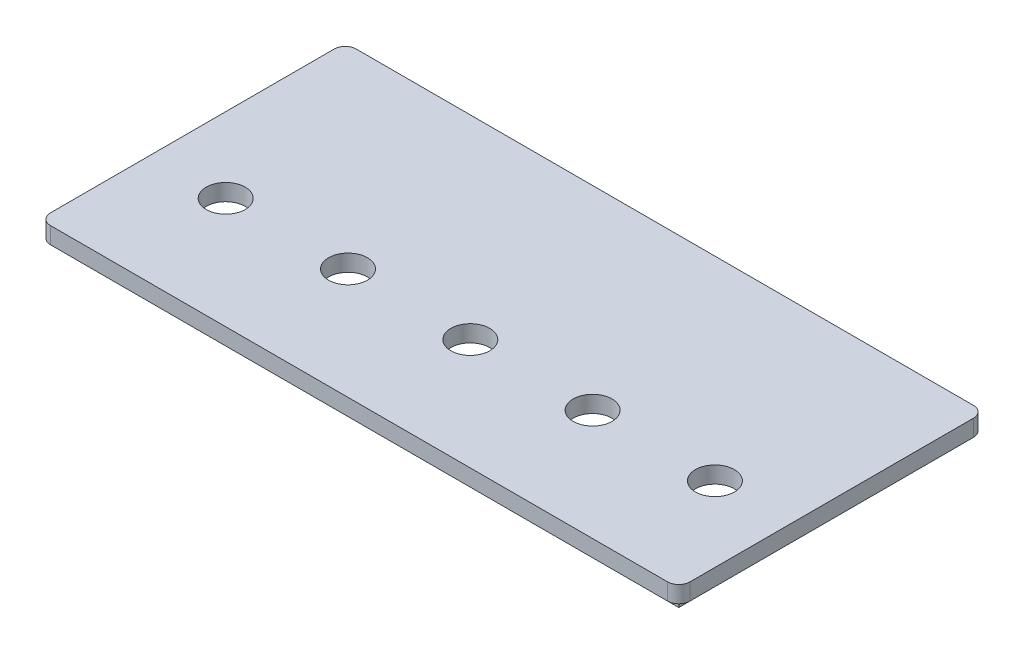
ISO-10303-21;
HEADER;
FILE_DESCRIPTION(('STEP AP214'),'2;1');
FILE_NAME('part.step','',(''),(''),'','','');
FILE_SCHEMA(('AUTOMOTIVE_DESIGN { 1 0 10303 214 1 1 1 1 }'));
ENDSEC;
DATA;
#1=APPLICATION_CONTEXT('core data for automotive mechanical design processes');
#2=APPLICATION_PROTOCOL_DEFINITION('international standard','automotive_design',2000,#1);
#3=PRODUCT_CONTEXT('',#1,'mechanical');
#4=PRODUCT('Part','Part','',(#3));
#5=PRODUCT_RELATED_PRODUCT_CATEGORY('part','',(#4));
#6=PRODUCT_DEFINITION_FORMATION('','',#4);
#7=PRODUCT_DEFINITION_CONTEXT('part definition',#1,'design');
#8=PRODUCT_DEFINITION('design','',#6,#7);
#9=PRODUCT_DEFINITION_SHAPE('','',#8);
#10=(LENGTH_UNIT() NAMED_UNIT(*) SI_UNIT(.MILLI.,.METRE.));
#11=(NAMED_UNIT(*) PLANE_ANGLE_UNIT() SI_UNIT($,.RADIAN.));
#12=(NAMED_UNIT(*) SI_UNIT($,.STERADIAN.) SOLID_ANGLE_UNIT());
#13=UNCERTAINTY_MEASURE_WITH_UNIT(LENGTH_MEASURE(1.E-05),#10,'distance_accuracy_value','');
#14=(GEOMETRIC_REPRESENTATION_CONTEXT(3) GLOBAL_UNCERTAINTY_ASSIGNED_CONTEXT((#13)) GLOBAL_UNIT_ASSIGNED_CONTEXT((#10,
#11,#12)) REPRESENTATION_CONTEXT('',''));
#15=CARTESIAN_POINT('',(0.,0.,0.));
#16=DIRECTION('',(0.,0.,1.));
#17=DIRECTION('',(1.,0.,0.));
#18=AXIS2_PLACEMENT_3D('',#15,#16,#17);
#19=CARTESIAN_POINT('',(0.,0.,0.));
#20=DIRECTION('',(0.,-1.,0.));
#21=DIRECTION('',(0.,0.,-1.));
#22=AXIS2_PLACEMENT_3D('',#19,#20,#21);
#23=PLANE('',#22);
#24=DIRECTION('',(0.,0.,-1.));
#25=VECTOR('',#24,1.);
#26=CARTESIAN_POINT('',(57.5,0.,27.5));
#27=LINE('',#26,#25);
#28=CARTESIAN_POINT('',(57.5,0.,25.5));
#29=VERTEX_POINT('',#28);
#30=CARTESIAN_POINT('',(57.5,0.,-25.5));
#31=VERTEX_POINT('',#30);
#32=EDGE_CURVE('E253',#29,#31,#27,.T.);
#33=ORIENTED_EDGE('',*,*,#32,.F.);
#34=CARTESIAN_POINT('',(55.5,0.,25.5));
#35=DIRECTION('',(0.,-1.,0.));
#36=DIRECTION('',(0.,0.,-1.));
#37=AXIS2_PLACEMENT_3D('',#34,#35,#36);
#38=CIRCLE('',#37,2.);
#39=CARTESIAN_POINT('',(55.5,0.,27.5));
#40=VERTEX_POINT('',#39);
#41=EDGE_CURVE('E333',#29,#40,#38,.T.);
#42=ORIENTED_EDGE('',*,*,#41,.T.);
#43=DIRECTION('',(1.,0.,0.));
#44=VECTOR('',#43,1.);
#45=CARTESIAN_POINT('',(-57.5,0.,27.5));
#46=LINE('',#45,#44);
#47=CARTESIAN_POINT('',(-55.5,0.,27.5));
#48=VERTEX_POINT('',#47);
#49=EDGE_CURVE('E294',#48,#40,#46,.T.);
#50=ORIENTED_EDGE('',*,*,#49,.F.);
#51=CARTESIAN_POINT('',(-55.5,0.,25.5));
#52=DIRECTION('',(0.,-1.,0.));
#53=DIRECTION('',(0.,0.,-1.));
#54=AXIS2_PLACEMENT_3D('',#51,#52,#53);
#55=CIRCLE('',#54,2.);
#56=CARTESIAN_POINT('',(-57.5,0.,25.5));
#57=VERTEX_POINT('',#56);
#58=EDGE_CURVE('E327',#48,#57,#55,.T.);
#59=ORIENTED_EDGE('',*,*,#58,.T.);
#60=DIRECTION('',(0.,0.,1.));
#61=VECTOR('',#60,1.);
#62=CARTESIAN_POINT('',(-57.5,0.,27.5));
#63=LINE('',#62,#61);
#64=CARTESIAN_POINT('',(-57.5,0.,-25.5));
#65=VERTEX_POINT('',#64);
#66=EDGE_CURVE('E312',#65,#57,#63,.T.);
#67=ORIENTED_EDGE('',*,*,#66,.F.);
#68=CARTESIAN_POINT('',(-55.5,0.,-25.5));
#69=DIRECTION('',(0.,-1.,0.));
#70=DIRECTION('',(0.,0.,-1.));
#71=AXIS2_PLACEMENT_3D('',#68,#69,#70);
#72=CIRCLE('',#71,2.);
#73=CARTESIAN_POINT('',(-55.5,0.,-27.5));
#74=VERTEX_POINT('',#73);
#75=EDGE_CURVE('E324',#65,#74,#72,.T.);
#76=ORIENTED_EDGE('',*,*,#75,.T.);
#77=DIRECTION('',(-1.,0.,0.));
#78=VECTOR('',#77,1.);
#79=CARTESIAN_POINT('',(-57.5,0.,-27.5));
#80=LINE('',#79,#78);
#81=CARTESIAN_POINT('',(55.5,0.,-27.5));
#82=VERTEX_POINT('',#81);
#83=EDGE_CURVE('E308',#82,#74,#80,.T.);
#84=ORIENTED_EDGE('',*,*,#83,.F.);
#85=CARTESIAN_POINT('',(55.5,0.,-25.5));
#86=DIRECTION('',(0.,-1.,0.));
#87=DIRECTION('',(0.,0.,-1.));
#88=AXIS2_PLACEMENT_3D('',#85,#86,#87);
#89=CIRCLE('',#88,2.);
#90=EDGE_CURVE('E330',#82,#31,#89,.T.);
#91=ORIENTED_EDGE('',*,*,#90,.T.);
#92=EDGE_LOOP('',(#33,#42,#50,#59,#67,#76,#84,#91));
#93=FACE_BOUND('',#92,.T.);
#94=DIRECTION('',(-1.,0.,0.));
#95=VECTOR('',#94,1.);
#96=CARTESIAN_POINT('',(-55.5,0.,25.5));
#97=LINE('',#96,#95);
#98=CARTESIAN_POINT('',(55.5,0.,25.5));
#99=VERTEX_POINT('',#98);
#100=CARTESIAN_POINT('',(-55.5,0.,25.5));
#101=VERTEX_POINT('',#100);
#102=EDGE_CURVE('E226',#99,#101,#97,.T.);
#103=ORIENTED_EDGE('',*,*,#102,.F.);
#104=DIRECTION('',(0.,0.,1.));
#105=VECTOR('',#104,1.);
#106=CARTESIAN_POINT('',(55.5,0.,25.5));
#107=LINE('',#106,#105);
#108=CARTESIAN_POINT('',(55.5,0.,-25.5));
#109=VERTEX_POINT('',#108);
#110=EDGE_CURVE('E175',#109,#99,#107,.T.);
#111=ORIENTED_EDGE('',*,*,#110,.F.);
#112=DIRECTION('',(1.,0.,0.));
#113=VECTOR('',#112,1.);
#114=CARTESIAN_POINT('',(-55.5,0.,-25.5));
#115=LINE('',#114,#113);
#116=CARTESIAN_POINT('',(-55.5,0.,-25.5));
#117=VERTEX_POINT('',#116);
#118=EDGE_CURVE('E213',#117,#109,#115,.T.);
#119=ORIENTED_EDGE('',*,*,#118,.F.);
#120=DIRECTION('',(0.,0.,-1.));
#121=VECTOR('',#120,1.);
#122=CARTESIAN_POINT('',(-55.5,0.,25.5));
#123=LINE('',#122,#121);
#124=EDGE_CURVE('E229',#101,#117,#123,.T.);
#125=ORIENTED_EDGE('',*,*,#124,.F.);
#126=EDGE_LOOP('',(#103,#111,#119,#125));
#127=FACE_BOUND('',#126,.T.);
#128=ADVANCED_FACE('F39',(#93,#127),#23,.T.);
#129=CARTESIAN_POINT('',(57.5,3.,27.5));
#130=DIRECTION('',(-1.,0.,0.));
#131=DIRECTION('',(0.,0.,1.));
#132=AXIS2_PLACEMENT_3D('',#129,#130,#131);
#133=PLANE('',#132);
#134=DIRECTION('',(0.,0.,-1.));
#135=VECTOR('',#134,1.);
#136=CARTESIAN_POINT('',(57.5,3.,27.5));
#137=LINE('',#136,#135);
#138=CARTESIAN_POINT('',(57.5,3.,25.5));
#139=VERTEX_POINT('',#138);
#140=CARTESIAN_POINT('',(57.5,3.,-25.5));
#141=VERTEX_POINT('',#140);
#142=EDGE_CURVE('E289',#139,#141,#137,.T.);
#143=ORIENTED_EDGE('',*,*,#142,.F.);
#144=DIRECTION('',(0.,-1.,0.));
#145=VECTOR('',#144,1.);
#146=CARTESIAN_POINT('',(57.5,3.,25.5));
#147=LINE('',#146,#145);
#148=EDGE_CURVE('E320',#139,#29,#147,.T.);
#149=ORIENTED_EDGE('',*,*,#148,.T.);
#150=ORIENTED_EDGE('',*,*,#32,.T.);
#151=DIRECTION('',(0.,-1.,0.));
#152=VECTOR('',#151,1.);
#153=CARTESIAN_POINT('',(57.5,3.,-25.5));
#154=LINE('',#153,#152);
#155=EDGE_CURVE('E304',#31,#141,#154,.F.);
#156=ORIENTED_EDGE('',*,*,#155,.T.);
#157=EDGE_LOOP('',(#143,#149,#150,#156));
#158=FACE_BOUND('',#157,.T.);
#159=ADVANCED_FACE('F386',(#158),#133,.F.);
#160=CARTESIAN_POINT('',(-57.5,3.,-27.5));
#161=DIRECTION('',(0.,0.,1.));
#162=DIRECTION('',(1.,0.,0.));
#163=AXIS2_PLACEMENT_3D('',#160,#161,#162);
#164=PLANE('',#163);
#165=DIRECTION('',(-1.,0.,0.));
#166=VECTOR('',#165,1.);
#167=CARTESIAN_POINT('',(-57.5,3.,-27.5));
#168=LINE('',#167,#166);
#169=CARTESIAN_POINT('',(55.5,3.,-27.5));
#170=VERTEX_POINT('',#169);
#171=CARTESIAN_POINT('',(-55.5,3.,-27.5));
#172=VERTEX_POINT('',#171);
#173=EDGE_CURVE('E293',#170,#172,#168,.T.);
#174=ORIENTED_EDGE('',*,*,#173,.F.);
#175=DIRECTION('',(0.,-1.,0.));
#176=VECTOR('',#175,1.);
#177=CARTESIAN_POINT('',(55.5,3.,-27.5));
#178=LINE('',#177,#176);
#179=EDGE_CURVE('E357',#170,#82,#178,.T.);
#180=ORIENTED_EDGE('',*,*,#179,.T.);
#181=ORIENTED_EDGE('',*,*,#83,.T.);
#182=DIRECTION('',(0.,-1.,0.));
#183=VECTOR('',#182,1.);
#184=CARTESIAN_POINT('',(-55.5,3.,-27.5));
#185=LINE('',#184,#183);
#186=EDGE_CURVE('E354',#74,#172,#185,.F.);
#187=ORIENTED_EDGE('',*,*,#186,.T.);
#188=EDGE_LOOP('',(#174,#180,#181,#187));
#189=FACE_BOUND('',#188,.T.);
#190=ADVANCED_FACE('F394',(#189),#164,.F.);
#191=CARTESIAN_POINT('',(-57.5,3.,27.5));
#192=DIRECTION('',(1.,0.,0.));
#193=DIRECTION('',(0.,0.,-1.));
#194=AXIS2_PLACEMENT_3D('',#191,#192,#193);
#195=PLANE('',#194);
#196=ORIENTED_EDGE('',*,*,#66,.T.);
#197=DIRECTION('',(0.,-1.,0.));
#198=VECTOR('',#197,1.);
#199=CARTESIAN_POINT('',(-57.5,3.,25.5));
#200=LINE('',#199,#198);
#201=CARTESIAN_POINT('',(-57.5,3.,25.5));
#202=VERTEX_POINT('',#201);
#203=EDGE_CURVE('E11',#57,#202,#200,.F.);
#204=ORIENTED_EDGE('',*,*,#203,.T.);
#205=DIRECTION('',(0.,0.,1.));
#206=VECTOR('',#205,1.);
#207=CARTESIAN_POINT('',(-57.5,3.,27.5));
#208=LINE('',#207,#206);
#209=CARTESIAN_POINT('',(-57.5,3.,-25.5));
#210=VERTEX_POINT('',#209);
#211=EDGE_CURVE('E297',#210,#202,#208,.T.);
#212=ORIENTED_EDGE('',*,*,#211,.F.);
#213=DIRECTION('',(0.,-1.,0.));
#214=VECTOR('',#213,1.);
#215=CARTESIAN_POINT('',(-57.5,3.,-25.5));
#216=LINE('',#215,#214);
#217=EDGE_CURVE('E48',#210,#65,#216,.T.);
#218=ORIENTED_EDGE('',*,*,#217,.T.);
#219=EDGE_LOOP('',(#196,#204,#212,#218));
#220=FACE_BOUND('',#219,.T.);
#221=ADVANCED_FACE('F364',(#220),#195,.F.);
#222=CARTESIAN_POINT('',(-57.5,3.,27.5));
#223=DIRECTION('',(0.,0.,-1.));
#224=DIRECTION('',(-1.,0.,0.));
#225=AXIS2_PLACEMENT_3D('',#222,#223,#224);
#226=PLANE('',#225);
#227=ORIENTED_EDGE('',*,*,#49,.T.);
#228=DIRECTION('',(0.,-1.,0.));
#229=VECTOR('',#228,1.);
#230=CARTESIAN_POINT('',(55.5,3.,27.5));
#231=LINE('',#230,#229);
#232=CARTESIAN_POINT('',(55.5,3.,27.5));
#233=VERTEX_POINT('',#232);
#234=EDGE_CURVE('E340',#40,#233,#231,.F.);
#235=ORIENTED_EDGE('',*,*,#234,.T.);
#236=DIRECTION('',(1.,0.,0.));
#237=VECTOR('',#236,1.);
#238=CARTESIAN_POINT('',(-57.5,3.,27.5));
#239=LINE('',#238,#237);
#240=CARTESIAN_POINT('',(-55.5,3.,27.5));
#241=VERTEX_POINT('',#240);
#242=EDGE_CURVE('E300',#241,#233,#239,.T.);
#243=ORIENTED_EDGE('',*,*,#242,.F.);
#244=DIRECTION('',(0.,-1.,0.));
#245=VECTOR('',#244,1.);
#246=CARTESIAN_POINT('',(-55.5,3.,27.5));
#247=LINE('',#246,#245);
#248=EDGE_CURVE('E336',#241,#48,#247,.T.);
#249=ORIENTED_EDGE('',*,*,#248,.T.);
#250=EDGE_LOOP('',(#227,#235,#243,#249));
#251=FACE_BOUND('',#250,.T.);
#252=ADVANCED_FACE('F377',(#251),#226,.F.);
#253=CARTESIAN_POINT('',(0.,3.,0.));
#254=DIRECTION('',(0.,-1.,0.));
#255=DIRECTION('',(0.,0.,-1.));
#256=AXIS2_PLACEMENT_3D('',#253,#254,#255);
#257=PLANE('',#256);
#258=CARTESIAN_POINT('',(-44.,3.,7.50000000000001));
#259=DIRECTION('',(0.,1.,0.));
#260=DIRECTION('',(0.,0.,1.));
#261=AXIS2_PLACEMENT_3D('',#258,#259,#260);
#262=CIRCLE('',#261,3.5);
#263=CARTESIAN_POINT('',(-44.,3.,11.));
#264=VERTEX_POINT('',#263);
#265=EDGE_CURVE('E254',#264,#264,#262,.T.);
#266=ORIENTED_EDGE('',*,*,#265,.F.);
#267=EDGE_LOOP('',(#266));
#268=FACE_BOUND('',#267,.T.);
#269=CARTESIAN_POINT('',(-22.,3.,7.50000000000001));
#270=DIRECTION('',(0.,1.,0.));
#271=DIRECTION('',(0.,0.,1.));
#272=AXIS2_PLACEMENT_3D('',#269,#270,#271);
#273=CIRCLE('',#272,3.5);
#274=CARTESIAN_POINT('',(-22.,3.,11.));
#275=VERTEX_POINT('',#274);
#276=EDGE_CURVE('E262',#275,#275,#273,.T.);
#277=ORIENTED_EDGE('',*,*,#276,.F.);
#278=EDGE_LOOP('',(#277));
#279=FACE_BOUND('',#278,.T.);
#280=CARTESIAN_POINT('',(0.,3.,7.50000000000001));
#281=DIRECTION('',(0.,1.,0.));
#282=DIRECTION('',(0.,0.,1.));
#283=AXIS2_PLACEMENT_3D('',#280,#281,#282);
#284=CIRCLE('',#283,3.5);
#285=CARTESIAN_POINT('',(0.,3.,11.));
#286=VERTEX_POINT('',#285);
#287=EDGE_CURVE('E270',#286,#286,#284,.T.);
#288=ORIENTED_EDGE('',*,*,#287,.F.);
#289=EDGE_LOOP('',(#288));
#290=FACE_BOUND('',#289,.T.);
#291=CARTESIAN_POINT('',(22.,3.,7.50000000000001));
#292=DIRECTION('',(0.,1.,0.));
#293=DIRECTION('',(0.,0.,1.));
#294=AXIS2_PLACEMENT_3D('',#291,#292,#293);
#295=CIRCLE('',#294,3.5);
#296=CARTESIAN_POINT('',(22.,3.,11.));
#297=VERTEX_POINT('',#296);
#298=EDGE_CURVE('E278',#297,#297,#295,.T.);
#299=ORIENTED_EDGE('',*,*,#298,.F.);
#300=EDGE_LOOP('',(#299));
#301=FACE_BOUND('',#300,.T.);
#302=CARTESIAN_POINT('',(44.,3.,7.50000000000001));
#303=DIRECTION('',(0.,1.,0.));
#304=DIRECTION('',(0.,0.,1.));
#305=AXIS2_PLACEMENT_3D('',#302,#303,#304);
#306=CIRCLE('',#305,3.5);
#307=CARTESIAN_POINT('',(44.,3.,11.));
#308=VERTEX_POINT('',#307);
#309=EDGE_CURVE('E248',#308,#308,#306,.T.);
#310=ORIENTED_EDGE('',*,*,#309,.F.);
#311=EDGE_LOOP('',(#310));
#312=FACE_BOUND('',#311,.T.);
#313=ORIENTED_EDGE('',*,*,#242,.T.);
#314=CARTESIAN_POINT('',(55.5,3.,25.5));
#315=DIRECTION('',(0.,-1.,0.));
#316=DIRECTION('',(0.,0.,-1.));
#317=AXIS2_PLACEMENT_3D('',#314,#315,#316);
#318=CIRCLE('',#317,2.);
#319=EDGE_CURVE('E351',#233,#139,#318,.F.);
#320=ORIENTED_EDGE('',*,*,#319,.T.);
#321=ORIENTED_EDGE('',*,*,#142,.T.);
#322=CARTESIAN_POINT('',(55.5,3.,-25.5));
#323=DIRECTION('',(0.,-1.,0.));
#324=DIRECTION('',(0.,0.,-1.));
#325=AXIS2_PLACEMENT_3D('',#322,#323,#324);
#326=CIRCLE('',#325,2.);
#327=EDGE_CURVE('E348',#141,#170,#326,.F.);
#328=ORIENTED_EDGE('',*,*,#327,.T.);
#329=ORIENTED_EDGE('',*,*,#173,.T.);
#330=CARTESIAN_POINT('',(-55.5,3.,-25.5));
#331=DIRECTION('',(0.,-1.,0.));
#332=DIRECTION('',(0.,0.,-1.));
#333=AXIS2_PLACEMENT_3D('',#330,#331,#332);
#334=CIRCLE('',#333,2.);
#335=EDGE_CURVE('E60',#172,#210,#334,.F.);
#336=ORIENTED_EDGE('',*,*,#335,.T.);
#337=ORIENTED_EDGE('',*,*,#211,.T.);
#338=CARTESIAN_POINT('',(-55.5,3.,25.5));
#339=DIRECTION('',(0.,-1.,0.));
#340=DIRECTION('',(0.,0.,-1.));
#341=AXIS2_PLACEMENT_3D('',#338,#339,#340);
#342=CIRCLE('',#341,2.);
#343=EDGE_CURVE('E345',#202,#241,#342,.F.);
#344=ORIENTED_EDGE('',*,*,#343,.T.);
#345=EDGE_LOOP('',(#313,#320,#321,#328,#329,#336,#337,#344));
#346=FACE_BOUND('',#345,.T.);
#347=ADVANCED_FACE('F380',(#268,#279,#290,#301,#312,#346),#257,.F.);
#348=DIRECTION('',(0.,0.,-1.));
#349=VECTOR('',#348,1.);
#350=CARTESIAN_POINT('',(-53.5,0.,23.5));
#351=LINE('',#350,#349);
#352=CARTESIAN_POINT('',(-53.5,0.,23.5));
#353=VERTEX_POINT('',#352);
#354=CARTESIAN_POINT('',(-53.5,0.,-23.5));
#355=VERTEX_POINT('',#354);
#356=EDGE_CURVE('E190',#353,#355,#351,.T.);
#357=ORIENTED_EDGE('',*,*,#356,.T.);
#358=DIRECTION('',(1.,0.,0.));
#359=VECTOR('',#358,1.);
#360=CARTESIAN_POINT('',(53.5,0.,-23.5));
#361=LINE('',#360,#359);
#362=CARTESIAN_POINT('',(53.5,0.,-23.5));
#363=VERTEX_POINT('',#362);
#364=EDGE_CURVE('E173',#355,#363,#361,.T.);
#365=ORIENTED_EDGE('',*,*,#364,.T.);
#366=DIRECTION('',(0.,0.,1.));
#367=VECTOR('',#366,1.);
#368=CARTESIAN_POINT('',(53.5,0.,23.5));
#369=LINE('',#368,#367);
#370=CARTESIAN_POINT('',(53.5,0.,23.5));
#371=VERTEX_POINT('',#370);
#372=EDGE_CURVE('E195',#363,#371,#369,.T.);
#373=ORIENTED_EDGE('',*,*,#372,.T.);
#374=DIRECTION('',(-1.,0.,0.));
#375=VECTOR('',#374,1.);
#376=CARTESIAN_POINT('',(53.5,0.,23.5));
#377=LINE('',#376,#375);
#378=EDGE_CURVE('E166',#371,#353,#377,.T.);
#379=ORIENTED_EDGE('',*,*,#378,.T.);
#380=EDGE_LOOP('',(#357,#365,#373,#379));
#381=FACE_BOUND('',#380,.T.);
#382=CARTESIAN_POINT('',(-44.,0.,7.50000000000001));
#383=DIRECTION('',(0.,1.,0.));
#384=DIRECTION('',(0.,0.,1.));
#385=AXIS2_PLACEMENT_3D('',#382,#383,#384);
#386=CIRCLE('',#385,3.5);
#387=CARTESIAN_POINT('',(-44.,0.,11.));
#388=VERTEX_POINT('',#387);
#389=EDGE_CURVE('E249',#388,#388,#386,.T.);
#390=ORIENTED_EDGE('',*,*,#389,.T.);
#391=EDGE_LOOP('',(#390));
#392=FACE_BOUND('',#391,.T.);
#393=CARTESIAN_POINT('',(-22.,0.,7.50000000000001));
#394=DIRECTION('',(0.,1.,0.));
#395=DIRECTION('',(0.,0.,1.));
#396=AXIS2_PLACEMENT_3D('',#393,#394,#395);
#397=CIRCLE('',#396,3.5);
#398=CARTESIAN_POINT('',(-22.,0.,11.));
#399=VERTEX_POINT('',#398);
#400=EDGE_CURVE('E258',#399,#399,#397,.T.);
#401=ORIENTED_EDGE('',*,*,#400,.T.);
#402=EDGE_LOOP('',(#401));
#403=FACE_BOUND('',#402,.T.);
#404=CARTESIAN_POINT('',(0.,0.,7.50000000000001));
#405=DIRECTION('',(0.,1.,0.));
#406=DIRECTION('',(0.,0.,1.));
#407=AXIS2_PLACEMENT_3D('',#404,#405,#406);
#408=CIRCLE('',#407,3.5);
#409=CARTESIAN_POINT('',(0.,0.,11.));
#410=VERTEX_POINT('',#409);
#411=EDGE_CURVE('E266',#410,#410,#408,.T.);
#412=ORIENTED_EDGE('',*,*,#411,.T.);
#413=EDGE_LOOP('',(#412));
#414=FACE_BOUND('',#413,.T.);
#415=CARTESIAN_POINT('',(22.,0.,7.50000000000001));
#416=DIRECTION('',(0.,1.,0.));
#417=DIRECTION('',(0.,0.,1.));
#418=AXIS2_PLACEMENT_3D('',#415,#416,#417);
#419=CIRCLE('',#418,3.5);
#420=CARTESIAN_POINT('',(22.,0.,11.));
#421=VERTEX_POINT('',#420);
#422=EDGE_CURVE('E274',#421,#421,#419,.T.);
#423=ORIENTED_EDGE('',*,*,#422,.T.);
#424=EDGE_LOOP('',(#423));
#425=FACE_BOUND('',#424,.T.);
#426=CARTESIAN_POINT('',(44.,0.,7.50000000000001));
#427=DIRECTION('',(0.,1.,0.));
#428=DIRECTION('',(0.,0.,1.));
#429=AXIS2_PLACEMENT_3D('',#426,#427,#428);
#430=CIRCLE('',#429,3.5);
#431=CARTESIAN_POINT('',(44.,0.,11.));
#432=VERTEX_POINT('',#431);
#433=EDGE_CURVE('E282',#432,#432,#430,.T.);
#434=ORIENTED_EDGE('',*,*,#433,.T.);
#435=EDGE_LOOP('',(#434));
#436=FACE_BOUND('',#435,.T.);
#437=ADVANCED_FACE('F402',(#381,#392,#403,#414,#425,#436),#23,.T.);
#438=CARTESIAN_POINT('',(44.,0.,7.50000000000001));
#439=DIRECTION('',(0.,1.,0.));
#440=DIRECTION('',(0.,0.,1.));
#441=AXIS2_PLACEMENT_3D('',#438,#439,#440);
#442=CYLINDRICAL_SURFACE('',#441,3.5);
#443=ORIENTED_EDGE('',*,*,#433,.F.);
#444=EDGE_LOOP('',(#443));
#445=FACE_BOUND('',#444,.T.);
#446=ORIENTED_EDGE('',*,*,#309,.T.);
#447=EDGE_LOOP('',(#446));
#448=FACE_BOUND('',#447,.T.);
#449=ADVANCED_FACE('F410',(#445,#448),#442,.F.);
#450=CARTESIAN_POINT('',(22.,0.,7.50000000000001));
#451=DIRECTION('',(0.,1.,0.));
#452=DIRECTION('',(0.,0.,1.));
#453=AXIS2_PLACEMENT_3D('',#450,#451,#452);
#454=CYLINDRICAL_SURFACE('',#453,3.5);
#455=ORIENTED_EDGE('',*,*,#422,.F.);
#456=EDGE_LOOP('',(#455));
#457=FACE_BOUND('',#456,.T.);
#458=ORIENTED_EDGE('',*,*,#298,.T.);
#459=EDGE_LOOP('',(#458));
#460=FACE_BOUND('',#459,.T.);
#461=ADVANCED_FACE('F416',(#457,#460),#454,.F.);
#462=CARTESIAN_POINT('',(0.,0.,7.50000000000001));
#463=DIRECTION('',(0.,1.,0.));
#464=DIRECTION('',(0.,0.,1.));
#465=AXIS2_PLACEMENT_3D('',#462,#463,#464);
#466=CYLINDRICAL_SURFACE('',#465,3.5);
#467=ORIENTED_EDGE('',*,*,#411,.F.);
#468=EDGE_LOOP('',(#467));
#469=FACE_BOUND('',#468,.T.);
#470=ORIENTED_EDGE('',*,*,#287,.T.);
#471=EDGE_LOOP('',(#470));
#472=FACE_BOUND('',#471,.T.);
#473=ADVANCED_FACE('F436',(#469,#472),#466,.F.);
#474=CARTESIAN_POINT('',(-22.,0.,7.50000000000001));
#475=DIRECTION('',(0.,1.,0.));
#476=DIRECTION('',(0.,0.,1.));
#477=AXIS2_PLACEMENT_3D('',#474,#475,#476);
#478=CYLINDRICAL_SURFACE('',#477,3.5);
#479=ORIENTED_EDGE('',*,*,#400,.F.);
#480=EDGE_LOOP('',(#479));
#481=FACE_BOUND('',#480,.T.);
#482=ORIENTED_EDGE('',*,*,#276,.T.);
#483=EDGE_LOOP('',(#482));
#484=FACE_BOUND('',#483,.T.);
#485=ADVANCED_FACE('F443',(#481,#484),#478,.F.);
#486=CARTESIAN_POINT('',(-44.,0.,7.50000000000001));
#487=DIRECTION('',(0.,1.,0.));
#488=DIRECTION('',(0.,0.,1.));
#489=AXIS2_PLACEMENT_3D('',#486,#487,#488);
#490=CYLINDRICAL_SURFACE('',#489,3.5);
#491=ORIENTED_EDGE('',*,*,#389,.F.);
#492=EDGE_LOOP('',(#491));
#493=FACE_BOUND('',#492,.T.);
#494=ORIENTED_EDGE('',*,*,#265,.T.);
#495=EDGE_LOOP('',(#494));
#496=FACE_BOUND('',#495,.T.);
#497=ADVANCED_FACE('F449',(#493,#496),#490,.F.);
#498=CARTESIAN_POINT('',(0.,-2.,0.));
#499=DIRECTION('',(0.,-1.,0.));
#500=DIRECTION('',(0.,0.,-1.));
#501=AXIS2_PLACEMENT_3D('',#498,#499,#500);
#502=PLANE('',#501);
#503=DIRECTION('',(0.,0.,1.));
#504=VECTOR('',#503,1.);
#505=CARTESIAN_POINT('',(55.5,-2.,25.5));
#506=LINE('',#505,#504);
#507=CARTESIAN_POINT('',(55.5,-2.,-25.5));
#508=VERTEX_POINT('',#507);
#509=CARTESIAN_POINT('',(55.5,-2.,25.5));
#510=VERTEX_POINT('',#509);
#511=EDGE_CURVE('E208',#508,#510,#506,.T.);
#512=ORIENTED_EDGE('',*,*,#511,.T.);
#513=DIRECTION('',(-1.,0.,0.));
#514=VECTOR('',#513,1.);
#515=CARTESIAN_POINT('',(-55.5,-2.,25.5));
#516=LINE('',#515,#514);
#517=CARTESIAN_POINT('',(-55.5,-2.,25.5));
#518=VERTEX_POINT('',#517);
#519=EDGE_CURVE('E212',#510,#518,#516,.T.);
#520=ORIENTED_EDGE('',*,*,#519,.T.);
#521=DIRECTION('',(0.,0.,-1.));
#522=VECTOR('',#521,1.);
#523=CARTESIAN_POINT('',(-55.5,-2.,25.5));
#524=LINE('',#523,#522);
#525=CARTESIAN_POINT('',(-55.5,-2.,-25.5));
#526=VERTEX_POINT('',#525);
#527=EDGE_CURVE('E216',#518,#526,#524,.T.);
#528=ORIENTED_EDGE('',*,*,#527,.T.);
#529=DIRECTION('',(1.,0.,0.));
#530=VECTOR('',#529,1.);
#531=CARTESIAN_POINT('',(-55.5,-2.,-25.5));
#532=LINE('',#531,#530);
#533=EDGE_CURVE('E219',#526,#508,#532,.T.);
#534=ORIENTED_EDGE('',*,*,#533,.T.);
#535=EDGE_LOOP('',(#512,#520,#528,#534));
#536=FACE_BOUND('',#535,.T.);
#537=DIRECTION('',(1.,0.,0.));
#538=VECTOR('',#537,1.);
#539=CARTESIAN_POINT('',(53.5,-2.,-23.5));
#540=LINE('',#539,#538);
#541=CARTESIAN_POINT('',(-53.5,-2.,-23.5));
#542=VERTEX_POINT('',#541);
#543=CARTESIAN_POINT('',(53.5,-2.,-23.5));
#544=VERTEX_POINT('',#543);
#545=EDGE_CURVE('E165',#542,#544,#540,.T.);
#546=ORIENTED_EDGE('',*,*,#545,.F.);
#547=DIRECTION('',(0.,0.,-1.));
#548=VECTOR('',#547,1.);
#549=CARTESIAN_POINT('',(-53.5,-2.,23.5));
#550=LINE('',#549,#548);
#551=CARTESIAN_POINT('',(-53.5,-2.,23.5));
#552=VERTEX_POINT('',#551);
#553=EDGE_CURVE('E154',#552,#542,#550,.T.);
#554=ORIENTED_EDGE('',*,*,#553,.F.);
#555=DIRECTION('',(-1.,0.,0.));
#556=VECTOR('',#555,1.);
#557=CARTESIAN_POINT('',(53.5,-2.,23.5));
#558=LINE('',#557,#556);
#559=CARTESIAN_POINT('',(53.5,-2.,23.5));
#560=VERTEX_POINT('',#559);
#561=EDGE_CURVE('E185',#560,#552,#558,.T.);
#562=ORIENTED_EDGE('',*,*,#561,.F.);
#563=DIRECTION('',(0.,0.,1.));
#564=VECTOR('',#563,1.);
#565=CARTESIAN_POINT('',(53.5,-2.,23.5));
#566=LINE('',#565,#564);
#567=EDGE_CURVE('E181',#544,#560,#566,.T.);
#568=ORIENTED_EDGE('',*,*,#567,.F.);
#569=EDGE_LOOP('',(#546,#554,#562,#568));
#570=FACE_BOUND('',#569,.T.);
#571=ADVANCED_FACE('F179',(#536,#570),#502,.T.);
#572=CARTESIAN_POINT('',(55.5,-2.,25.5));
#573=DIRECTION('',(-1.,0.,0.));
#574=DIRECTION('',(0.,0.,1.));
#575=AXIS2_PLACEMENT_3D('',#572,#573,#574);
#576=PLANE('',#575);
#577=ORIENTED_EDGE('',*,*,#110,.T.);
#578=DIRECTION('',(0.,1.,0.));
#579=VECTOR('',#578,1.);
#580=CARTESIAN_POINT('',(55.5,-2.,25.5));
#581=LINE('',#580,#579);
#582=EDGE_CURVE('E245',#510,#99,#581,.T.);
#583=ORIENTED_EDGE('',*,*,#582,.F.);
#584=ORIENTED_EDGE('',*,*,#511,.F.);
#585=DIRECTION('',(0.,1.,0.));
#586=VECTOR('',#585,1.);
#587=CARTESIAN_POINT('',(55.5,-2.,-25.5));
#588=LINE('',#587,#586);
#589=EDGE_CURVE('E222',#508,#109,#588,.T.);
#590=ORIENTED_EDGE('',*,*,#589,.T.);
#591=EDGE_LOOP('',(#577,#583,#584,#590));
#592=FACE_BOUND('',#591,.T.);
#593=ADVANCED_FACE('F454',(#592),#576,.F.);
#594=CARTESIAN_POINT('',(-55.5,-2.,25.5));
#595=DIRECTION('',(0.,0.,-1.));
#596=DIRECTION('',(-1.,0.,0.));
#597=AXIS2_PLACEMENT_3D('',#594,#595,#596);
#598=PLANE('',#597);
#599=ORIENTED_EDGE('',*,*,#102,.T.);
#600=DIRECTION('',(0.,1.,0.));
#601=VECTOR('',#600,1.);
#602=CARTESIAN_POINT('',(-55.5,-2.,25.5));
#603=LINE('',#602,#601);
#604=EDGE_CURVE('E241',#518,#101,#603,.T.);
#605=ORIENTED_EDGE('',*,*,#604,.F.);
#606=ORIENTED_EDGE('',*,*,#519,.F.);
#607=ORIENTED_EDGE('',*,*,#582,.T.);
#608=EDGE_LOOP('',(#599,#605,#606,#607));
#609=FACE_BOUND('',#608,.T.);
#610=ADVANCED_FACE('F457',(#609),#598,.F.);
#611=CARTESIAN_POINT('',(-55.5,-2.,25.5));
#612=DIRECTION('',(1.,0.,0.));
#613=DIRECTION('',(0.,0.,-1.));
#614=AXIS2_PLACEMENT_3D('',#611,#612,#613);
#615=PLANE('',#614);
#616=ORIENTED_EDGE('',*,*,#124,.T.);
#617=DIRECTION('',(0.,1.,0.));
#618=VECTOR('',#617,1.);
#619=CARTESIAN_POINT('',(-55.5,-2.,-25.5));
#620=LINE('',#619,#618);
#621=EDGE_CURVE('E238',#526,#117,#620,.T.);
#622=ORIENTED_EDGE('',*,*,#621,.F.);
#623=ORIENTED_EDGE('',*,*,#527,.F.);
#624=ORIENTED_EDGE('',*,*,#604,.T.);
#625=EDGE_LOOP('',(#616,#622,#623,#624));
#626=FACE_BOUND('',#625,.T.);
#627=ADVANCED_FACE('F461',(#626),#615,.F.);
#628=CARTESIAN_POINT('',(-55.5,-2.,-25.5));
#629=DIRECTION('',(0.,0.,1.));
#630=DIRECTION('',(1.,0.,0.));
#631=AXIS2_PLACEMENT_3D('',#628,#629,#630);
#632=PLANE('',#631);
#633=ORIENTED_EDGE('',*,*,#118,.T.);
#634=ORIENTED_EDGE('',*,*,#589,.F.);
#635=ORIENTED_EDGE('',*,*,#533,.F.);
#636=ORIENTED_EDGE('',*,*,#621,.T.);
#637=EDGE_LOOP('',(#633,#634,#635,#636));
#638=FACE_BOUND('',#637,.T.);
#639=ADVANCED_FACE('F465',(#638),#632,.F.);
#640=CARTESIAN_POINT('',(-53.5,-2.,23.5));
#641=DIRECTION('',(1.,0.,0.));
#642=DIRECTION('',(0.,0.,-1.));
#643=AXIS2_PLACEMENT_3D('',#640,#641,#642);
#644=PLANE('',#643);
#645=ORIENTED_EDGE('',*,*,#356,.F.);
#646=DIRECTION('',(0.,1.,0.));
#647=VECTOR('',#646,1.);
#648=CARTESIAN_POINT('',(-53.5,-2.,23.5));
#649=LINE('',#648,#647);
#650=EDGE_CURVE('E160',#552,#353,#649,.T.);
#651=ORIENTED_EDGE('',*,*,#650,.F.);
#652=ORIENTED_EDGE('',*,*,#553,.T.);
#653=DIRECTION('',(0.,1.,0.));
#654=VECTOR('',#653,1.);
#655=CARTESIAN_POINT('',(-53.5,-2.,-23.5));
#656=LINE('',#655,#654);
#657=EDGE_CURVE('E158',#542,#355,#656,.T.);
#658=ORIENTED_EDGE('',*,*,#657,.T.);
#659=EDGE_LOOP('',(#645,#651,#652,#658));
#660=FACE_BOUND('',#659,.T.);
#661=ADVANCED_FACE('F157',(#660),#644,.T.);
#662=CARTESIAN_POINT('',(53.5,-2.,-23.5));
#663=DIRECTION('',(0.,0.,1.));
#664=DIRECTION('',(1.,0.,0.));
#665=AXIS2_PLACEMENT_3D('',#662,#663,#664);
#666=PLANE('',#665);
#667=ORIENTED_EDGE('',*,*,#364,.F.);
#668=ORIENTED_EDGE('',*,*,#657,.F.);
#669=ORIENTED_EDGE('',*,*,#545,.T.);
#670=DIRECTION('',(0.,1.,0.));
#671=VECTOR('',#670,1.);
#672=CARTESIAN_POINT('',(53.5,-2.,-23.5));
#673=LINE('',#672,#671);
#674=EDGE_CURVE('E176',#544,#363,#673,.T.);
#675=ORIENTED_EDGE('',*,*,#674,.T.);
#676=EDGE_LOOP('',(#667,#668,#669,#675));
#677=FACE_BOUND('',#676,.T.);
#678=ADVANCED_FACE('F170',(#677),#666,.T.);
#679=CARTESIAN_POINT('',(53.5,-2.,23.5));
#680=DIRECTION('',(-1.,0.,0.));
#681=DIRECTION('',(0.,0.,1.));
#682=AXIS2_PLACEMENT_3D('',#679,#680,#681);
#683=PLANE('',#682);
#684=ORIENTED_EDGE('',*,*,#372,.F.);
#685=ORIENTED_EDGE('',*,*,#674,.F.);
#686=ORIENTED_EDGE('',*,*,#567,.T.);
#687=DIRECTION('',(0.,1.,0.));
#688=VECTOR('',#687,1.);
#689=CARTESIAN_POINT('',(53.5,-2.,23.5));
#690=LINE('',#689,#688);
#691=EDGE_CURVE('E202',#560,#371,#690,.T.);
#692=ORIENTED_EDGE('',*,*,#691,.T.);
#693=EDGE_LOOP('',(#684,#685,#686,#692));
#694=FACE_BOUND('',#693,.T.);
#695=ADVANCED_FACE('F477',(#694),#683,.T.);
#696=CARTESIAN_POINT('',(53.5,-2.,23.5));
#697=DIRECTION('',(0.,0.,-1.));
#698=DIRECTION('',(-1.,0.,0.));
#699=AXIS2_PLACEMENT_3D('',#696,#697,#698);
#700=PLANE('',#699);
#701=ORIENTED_EDGE('',*,*,#378,.F.);
#702=ORIENTED_EDGE('',*,*,#691,.F.);
#703=ORIENTED_EDGE('',*,*,#561,.T.);
#704=ORIENTED_EDGE('',*,*,#650,.T.);
#705=EDGE_LOOP('',(#701,#702,#703,#704));
#706=FACE_BOUND('',#705,.T.);
#707=ADVANCED_FACE('F480',(#706),#700,.T.);
#708=CARTESIAN_POINT('',(55.5,3.,25.5));
#709=DIRECTION('',(0.,-1.,0.));
#710=DIRECTION('',(0.,0.,-1.));
#711=AXIS2_PLACEMENT_3D('',#708,#709,#710);
#712=CYLINDRICAL_SURFACE('',#711,2.);
#713=ORIENTED_EDGE('',*,*,#319,.F.);
#714=ORIENTED_EDGE('',*,*,#234,.F.);
#715=ORIENTED_EDGE('',*,*,#41,.F.);
#716=ORIENTED_EDGE('',*,*,#148,.F.);
#717=EDGE_LOOP('',(#713,#714,#715,#716));
#718=FACE_BOUND('',#717,.T.);
#719=ADVANCED_FACE('F384',(#718),#712,.T.);
#720=CARTESIAN_POINT('',(55.5,3.,-25.5));
#721=DIRECTION('',(0.,-1.,0.));
#722=DIRECTION('',(0.,0.,-1.));
#723=AXIS2_PLACEMENT_3D('',#720,#721,#722);
#724=CYLINDRICAL_SURFACE('',#723,2.);
#725=ORIENTED_EDGE('',*,*,#327,.F.);
#726=ORIENTED_EDGE('',*,*,#155,.F.);
#727=ORIENTED_EDGE('',*,*,#90,.F.);
#728=ORIENTED_EDGE('',*,*,#179,.F.);
#729=EDGE_LOOP('',(#725,#726,#727,#728));
#730=FACE_BOUND('',#729,.T.);
#731=ADVANCED_FACE('F391',(#730),#724,.T.);
#732=CARTESIAN_POINT('',(-55.5,3.,25.5));
#733=DIRECTION('',(0.,-1.,0.));
#734=DIRECTION('',(0.,0.,-1.));
#735=AXIS2_PLACEMENT_3D('',#732,#733,#734);
#736=CYLINDRICAL_SURFACE('',#735,2.);
#737=ORIENTED_EDGE('',*,*,#343,.F.);
#738=ORIENTED_EDGE('',*,*,#203,.F.);
#739=ORIENTED_EDGE('',*,*,#58,.F.);
#740=ORIENTED_EDGE('',*,*,#248,.F.);
#741=EDGE_LOOP('',(#737,#738,#739,#740));
#742=FACE_BOUND('',#741,.T.);
#743=ADVANCED_FACE('F374',(#742),#736,.T.);
#744=CARTESIAN_POINT('',(-55.5,3.,-25.5));
#745=DIRECTION('',(0.,-1.,0.));
#746=DIRECTION('',(0.,0.,-1.));
#747=AXIS2_PLACEMENT_3D('',#744,#745,#746);
#748=CYLINDRICAL_SURFACE('',#747,2.);
#749=ORIENTED_EDGE('',*,*,#335,.F.);
#750=ORIENTED_EDGE('',*,*,#186,.F.);
#751=ORIENTED_EDGE('',*,*,#75,.F.);
#752=ORIENTED_EDGE('',*,*,#217,.F.);
#753=EDGE_LOOP('',(#749,#750,#751,#752));
#754=FACE_BOUND('',#753,.T.);
#755=ADVANCED_FACE('F41',(#754),#748,.T.);
#756=CLOSED_SHELL('',(#128,#159,#190,#221,#252,#347,#437,#449,#461,#473,#485,#497,#571,#593,
#610,#627,#639,#661,#678,#695,#707,#719,#731,#743,#755));
#757=MANIFOLD_SOLID_BREP('B2',#756);
#758=ADVANCED_BREP_SHAPE_REPRESENTATION('',(#18,#757),#14);
#759=SHAPE_DEFINITION_REPRESENTATION(#9,#758);
ENDSEC;
END-ISO-10303-21;
